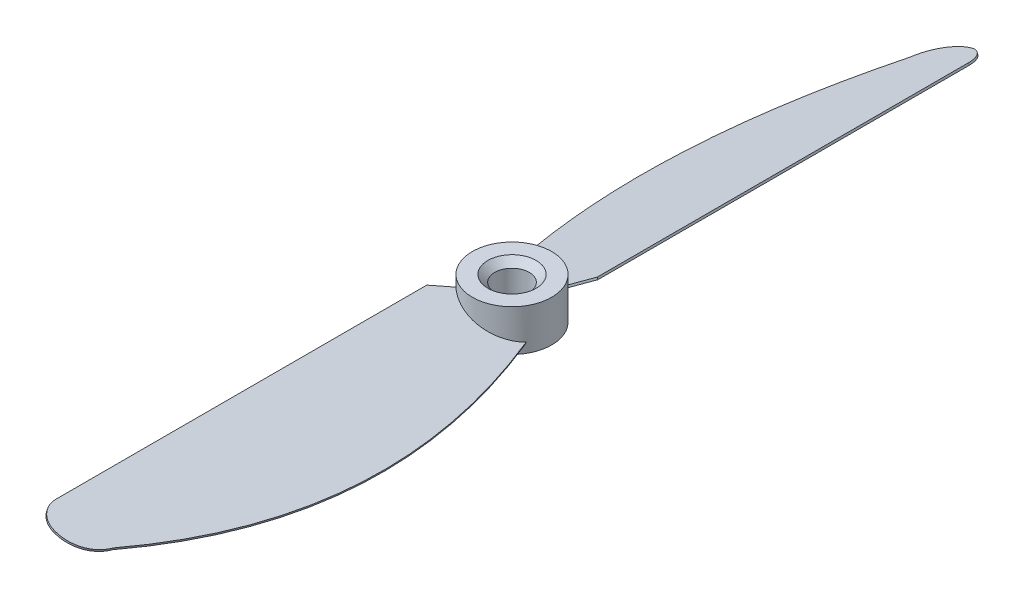
ISO-10303-21;
HEADER;
FILE_DESCRIPTION(('STEP AP214'),'2;1');
FILE_NAME('part.step','',(''),(''),'','','');
FILE_SCHEMA(('AUTOMOTIVE_DESIGN { 1 0 10303 214 1 1 1 1 }'));
ENDSEC;
DATA;
#1=APPLICATION_CONTEXT('core data for automotive mechanical design processes');
#2=APPLICATION_PROTOCOL_DEFINITION('international standard','automotive_design',2000,#1);
#3=PRODUCT_CONTEXT('',#1,'mechanical');
#4=PRODUCT('Part','Part','',(#3));
#5=PRODUCT_RELATED_PRODUCT_CATEGORY('part','',(#4));
#6=PRODUCT_DEFINITION_FORMATION('','',#4);
#7=PRODUCT_DEFINITION_CONTEXT('part definition',#1,'design');
#8=PRODUCT_DEFINITION('design','',#6,#7);
#9=PRODUCT_DEFINITION_SHAPE('','',#8);
#10=(LENGTH_UNIT() NAMED_UNIT(*) SI_UNIT(.MILLI.,.METRE.));
#11=(NAMED_UNIT(*) PLANE_ANGLE_UNIT() SI_UNIT($,.RADIAN.));
#12=(NAMED_UNIT(*) SI_UNIT($,.STERADIAN.) SOLID_ANGLE_UNIT());
#13=UNCERTAINTY_MEASURE_WITH_UNIT(LENGTH_MEASURE(1.E-05),#10,'distance_accuracy_value','');
#14=(GEOMETRIC_REPRESENTATION_CONTEXT(3) GLOBAL_UNCERTAINTY_ASSIGNED_CONTEXT((#13)) GLOBAL_UNIT_ASSIGNED_CONTEXT((#10,
#11,#12)) REPRESENTATION_CONTEXT('',''));
#15=CARTESIAN_POINT('',(0.,0.,0.));
#16=DIRECTION('',(0.,0.,1.));
#17=DIRECTION('',(1.,0.,0.));
#18=AXIS2_PLACEMENT_3D('',#15,#16,#17);
#19=CARTESIAN_POINT('',(0.,3.,0.));
#20=DIRECTION('',(0.,-1.,0.));
#21=DIRECTION('',(0.,0.,-1.));
#22=AXIS2_PLACEMENT_3D('',#19,#20,#21);
#23=CYLINDRICAL_SURFACE('',#22,5.75);
#24=CARTESIAN_POINT('',(-4.8920159777746,-1.88043468735762,-3.0217014533534));
#25=CARTESIAN_POINT('',(-4.9027984834071,-1.83112444759788,-3.00424775742399));
#26=CARTESIAN_POINT('',(-4.91352065409866,-1.78184257242605,-2.98667868683996));
#27=CARTESIAN_POINT('',(-4.93484432559993,-1.68333555125825,-2.95130979636263));
#28=CARTESIAN_POINT('',(-4.94544582640962,-1.63411040526227,-2.93350997646934));
#29=CARTESIAN_POINT('',(-4.95598699227839,-1.58491362385422,-2.91559478192142));
#30=B_SPLINE_CURVE_WITH_KNOTS('',3,(#24,#25,#26,#27,#28,#29),.UNSPECIFIED.,.F.,.F.,(4,2,4),(0.,
0.160221920016564,0.320443840033127),.UNSPECIFIED.);
#31=CARTESIAN_POINT('',(-4.8920159777746,-1.88043468735762,-3.0217014533534));
#32=VERTEX_POINT('',#31);
#33=CARTESIAN_POINT('',(-4.95598699227839,-1.58491362385422,-2.91559478192142));
#34=VERTEX_POINT('',#33);
#35=EDGE_CURVE('E60',#32,#34,#30,.T.);
#36=ORIENTED_EDGE('',*,*,#35,.F.);
#37=CARTESIAN_POINT('',(0.,-0.159015699309601,0.));
#38=DIRECTION('',(0.331932653611141,-0.943303086747131,0.));
#39=DIRECTION('',(-0.943303086747132,-0.331932653611141,0.));
#40=AXIS2_PLACEMENT_3D('',#37,#38,#39);
#41=ELLIPSE('',#40,6.09560180686803,5.75);
#42=CARTESIAN_POINT('',(3.98150996275321,1.24201137871389,-4.14850315372869));
#43=VERTEX_POINT('',#42);
#44=EDGE_CURVE('E61',#32,#43,#41,.T.);
#45=ORIENTED_EDGE('',*,*,#44,.T.);
#46=CARTESIAN_POINT('',(0.,3.1703775042026,0.));
#47=DIRECTION('',(-0.754266546104331,-0.26541384173975,-0.600530990075275));
#48=DIRECTION('',(0.207639872473479,-0.964134582209842,0.165318452527993));
#49=AXIS2_PLACEMENT_3D('',#46,#47,#48);
#50=ELLIPSE('',#49,21.6642808163643,5.75);
#51=CARTESIAN_POINT('',(3.92189172051821,1.53906411032063,-4.2049096699609));
#52=VERTEX_POINT('',#51);
#53=EDGE_CURVE('E252',#52,#43,#50,.T.);
#54=ORIENTED_EDGE('',*,*,#53,.F.);
#55=CARTESIAN_POINT('',(0.,0.1590156993096,0.));
#56=DIRECTION('',(0.331932653611141,-0.943303086747131,0.));
#57=DIRECTION('',(-0.943303086747132,-0.331932653611141,0.));
#58=AXIS2_PLACEMENT_3D('',#55,#56,#57);
#59=ELLIPSE('',#58,6.09560180686803,5.75);
#60=EDGE_CURVE('E355',#34,#52,#59,.T.);
#61=ORIENTED_EDGE('',*,*,#60,.F.);
#62=EDGE_LOOP('',(#36,#45,#54,#61));
#63=FACE_BOUND('',#62,.T.);
#64=CARTESIAN_POINT('',(4.8920159777746,-1.88043468735762,3.0217014533534));
#65=CARTESIAN_POINT('',(4.9027984834071,-1.83112444759788,3.00424775742399));
#66=CARTESIAN_POINT('',(4.91352065409866,-1.78184257242605,2.98667868683996));
#67=CARTESIAN_POINT('',(4.93484432559993,-1.68333555125825,2.95130979636263));
#68=CARTESIAN_POINT('',(4.94544582640962,-1.63411040526227,2.93350997646934));
#69=CARTESIAN_POINT('',(4.95598699227839,-1.58491362385422,2.91559478192142));
#70=B_SPLINE_CURVE_WITH_KNOTS('',3,(#64,#65,#66,#67,#68,#69),.UNSPECIFIED.,.F.,.F.,(4,2,4),(0.,
0.160221920016564,0.320443840033127),.UNSPECIFIED.);
#71=CARTESIAN_POINT('',(4.8920159777746,-1.88043468735762,3.0217014533534));
#72=VERTEX_POINT('',#71);
#73=CARTESIAN_POINT('',(4.95598699227839,-1.58491362385422,2.91559478192142));
#74=VERTEX_POINT('',#73);
#75=EDGE_CURVE('E226',#72,#74,#70,.T.);
#76=ORIENTED_EDGE('',*,*,#75,.F.);
#77=CARTESIAN_POINT('',(0.,-0.159015699309601,0.));
#78=DIRECTION('',(-0.331932653611141,-0.943303086747131,0.));
#79=DIRECTION('',(0.943303086747132,-0.331932653611141,0.));
#80=AXIS2_PLACEMENT_3D('',#77,#78,#79);
#81=ELLIPSE('',#80,6.09560180686803,5.75);
#82=CARTESIAN_POINT('',(-3.98150996275321,1.24201137871389,4.14850315372869));
#83=VERTEX_POINT('',#82);
#84=EDGE_CURVE('E231',#72,#83,#81,.T.);
#85=ORIENTED_EDGE('',*,*,#84,.T.);
#86=CARTESIAN_POINT('',(0.,3.1703775042026,0.));
#87=DIRECTION('',(0.754266546104331,-0.26541384173975,0.600530990075275));
#88=DIRECTION('',(-0.207639872473479,-0.964134582209842,-0.165318452527993));
#89=AXIS2_PLACEMENT_3D('',#86,#87,#88);
#90=ELLIPSE('',#89,21.6642808163643,5.75);
#91=CARTESIAN_POINT('',(-3.92189172051821,1.53906411032063,4.2049096699609));
#92=VERTEX_POINT('',#91);
#93=EDGE_CURVE('E237',#92,#83,#90,.T.);
#94=ORIENTED_EDGE('',*,*,#93,.F.);
#95=CARTESIAN_POINT('',(0.,0.1590156993096,0.));
#96=DIRECTION('',(-0.331932653611141,-0.943303086747131,0.));
#97=DIRECTION('',(0.943303086747132,-0.331932653611141,0.));
#98=AXIS2_PLACEMENT_3D('',#95,#96,#97);
#99=ELLIPSE('',#98,6.09560180686803,5.75);
#100=EDGE_CURVE('E327',#74,#92,#99,.T.);
#101=ORIENTED_EDGE('',*,*,#100,.F.);
#102=EDGE_LOOP('',(#76,#85,#94,#101));
#103=FACE_BOUND('',#102,.T.);
#104=CARTESIAN_POINT('',(0.,3.,0.));
#105=DIRECTION('',(0.,1.,0.));
#106=DIRECTION('',(0.,0.,1.));
#107=AXIS2_PLACEMENT_3D('',#104,#105,#106);
#108=CIRCLE('',#107,5.75);
#109=CARTESIAN_POINT('',(0.,3.,5.75));
#110=VERTEX_POINT('',#109);
#111=EDGE_CURVE('E324',#110,#110,#108,.T.);
#112=ORIENTED_EDGE('',*,*,#111,.F.);
#113=EDGE_LOOP('',(#112));
#114=FACE_BOUND('',#113,.T.);
#115=CARTESIAN_POINT('',(0.,-3.,0.));
#116=DIRECTION('',(0.,1.,0.));
#117=DIRECTION('',(0.,0.,1.));
#118=AXIS2_PLACEMENT_3D('',#115,#116,#117);
#119=CIRCLE('',#118,5.75);
#120=CARTESIAN_POINT('',(0.,-3.,5.75));
#121=VERTEX_POINT('',#120);
#122=EDGE_CURVE('E322',#121,#121,#119,.T.);
#123=ORIENTED_EDGE('',*,*,#122,.T.);
#124=EDGE_LOOP('',(#123));
#125=FACE_BOUND('',#124,.T.);
#126=ADVANCED_FACE('F41',(#63,#103,#114,#125),#23,.T.);
#127=CARTESIAN_POINT('',(0.,3.,0.));
#128=DIRECTION('',(0.,1.,0.));
#129=DIRECTION('',(0.,0.,1.));
#130=AXIS2_PLACEMENT_3D('',#127,#128,#129);
#131=PLANE('',#130);
#132=CARTESIAN_POINT('',(0.,3.,0.));
#133=DIRECTION('',(0.,1.,0.));
#134=DIRECTION('',(0.,0.,1.));
#135=AXIS2_PLACEMENT_3D('',#132,#133,#134);
#136=CIRCLE('',#135,3.50000000000003);
#137=CARTESIAN_POINT('',(0.,3.,3.50000000000003));
#138=VERTEX_POINT('',#137);
#139=EDGE_CURVE('E11',#138,#138,#136,.F.);
#140=ORIENTED_EDGE('',*,*,#139,.T.);
#141=EDGE_LOOP('',(#140));
#142=FACE_BOUND('',#141,.T.);
#143=ORIENTED_EDGE('',*,*,#111,.T.);
#144=EDGE_LOOP('',(#143));
#145=FACE_BOUND('',#144,.T.);
#146=ADVANCED_FACE('F224',(#142,#145),#131,.T.);
#147=CARTESIAN_POINT('',(0.,-3.,0.));
#148=DIRECTION('',(0.,1.,0.));
#149=DIRECTION('',(0.,0.,1.));
#150=AXIS2_PLACEMENT_3D('',#147,#148,#149);
#151=PLANE('',#150);
#152=CARTESIAN_POINT('',(0.,-3.,0.));
#153=DIRECTION('',(0.,1.,0.));
#154=DIRECTION('',(0.,0.,1.));
#155=AXIS2_PLACEMENT_3D('',#152,#153,#154);
#156=CIRCLE('',#155,3.49999999999991);
#157=CARTESIAN_POINT('',(0.,-3.,3.49999999999991));
#158=VERTEX_POINT('',#157);
#159=EDGE_CURVE('E404',#158,#158,#156,.T.);
#160=ORIENTED_EDGE('',*,*,#159,.T.);
#161=EDGE_LOOP('',(#160));
#162=FACE_BOUND('',#161,.T.);
#163=ORIENTED_EDGE('',*,*,#122,.F.);
#164=EDGE_LOOP('',(#163));
#165=FACE_BOUND('',#164,.T.);
#166=ADVANCED_FACE('F219',(#162,#165),#151,.F.);
#167=CARTESIAN_POINT('',(4.49028352582618,-1.73907172492231,1.84878855702583));
#168=CARTESIAN_POINT('',(14.9107340202523,-5.40585479076167,31.6127789858751));
#169=CARTESIAN_POINT('',(1.83195566354301,-0.803650401815136,59.7177951446198));
#170=B_SPLINE_CURVE_WITH_KNOTS('',2,(#167,#168,#169),.UNSPECIFIED.,.F.,.F.,(3,3),(0.,1.),.UNSPECIFIED.);
#171=DIRECTION('',(0.331932653611141,0.943303086747131,0.));
#172=VECTOR('',#171,1.);
#173=SURFACE_OF_LINEAR_EXTRUSION('',#170,#172);
#174=CARTESIAN_POINT('',(1.83195566354301,-0.803650401815135,59.7177951446198));
#175=VERTEX_POINT('',#174);
#176=EDGE_CURVE('E205',#72,#175,#170,.T.);
#177=ORIENTED_EDGE('',*,*,#176,.F.);
#178=ORIENTED_EDGE('',*,*,#75,.T.);
#179=CARTESIAN_POINT('',(4.58986332190952,-1.45608079889817,1.84878855702583));
#180=CARTESIAN_POINT('',(15.0103138163356,-5.12286386473753,31.6127789858751));
#181=CARTESIAN_POINT('',(1.93153545962635,-0.520659475790996,59.7177951446198));
#182=B_SPLINE_CURVE_WITH_KNOTS('',2,(#179,#180,#181),.UNSPECIFIED.,.F.,.F.,(3,3),(0.,1.),.UNSPECIFIED.);
#183=CARTESIAN_POINT('',(1.93153545962635,-0.520659475790996,59.7177951446198));
#184=VERTEX_POINT('',#183);
#185=EDGE_CURVE('E160',#74,#184,#182,.T.);
#186=ORIENTED_EDGE('',*,*,#185,.T.);
#187=DIRECTION('',(0.331932653611141,0.943303086747131,0.));
#188=VECTOR('',#187,1.);
#189=CARTESIAN_POINT('',(1.83195566354301,-0.803650401815135,59.7177951446198));
#190=LINE('',#189,#188);
#191=EDGE_CURVE('E321',#175,#184,#190,.T.);
#192=ORIENTED_EDGE('',*,*,#191,.F.);
#193=EDGE_LOOP('',(#177,#178,#186,#192));
#194=FACE_BOUND('',#193,.T.);
#195=ADVANCED_FACE('F212',(#194),#173,.F.);
#196=CARTESIAN_POINT('',(-2.74252698047144,0.806033891874515,58.5));
#197=DIRECTION('',(0.331932653611141,0.943303086747131,0.));
#198=DIRECTION('',(-0.943303086747131,0.331932653611141,0.));
#199=AXIS2_PLACEMENT_3D('',#196,#197,#198);
#200=CYLINDRICAL_SURFACE('',#199,5.);
#201=CARTESIAN_POINT('',(-2.64294718438809,1.08902481789865,58.5));
#202=DIRECTION('',(-0.331932653611141,-0.943303086747131,0.));
#203=DIRECTION('',(0.943303086747131,-0.331932653611141,0.));
#204=AXIS2_PLACEMENT_3D('',#201,#202,#203);
#205=CIRCLE('',#204,5.);
#206=CARTESIAN_POINT('',(-2.64294718438809,1.08902481789865,63.5));
#207=VERTEX_POINT('',#206);
#208=EDGE_CURVE('E297',#184,#207,#205,.T.);
#209=ORIENTED_EDGE('',*,*,#208,.T.);
#210=DIRECTION('',(0.331932653611141,0.943303086747131,0.));
#211=VECTOR('',#210,1.);
#212=CARTESIAN_POINT('',(-2.74252698047143,0.806033891874515,63.5));
#213=LINE('',#212,#211);
#214=CARTESIAN_POINT('',(-2.74252698047143,0.806033891874515,63.5));
#215=VERTEX_POINT('',#214);
#216=EDGE_CURVE('E294',#215,#207,#213,.T.);
#217=ORIENTED_EDGE('',*,*,#216,.F.);
#218=CARTESIAN_POINT('',(-2.74252698047144,0.806033891874515,58.5));
#219=DIRECTION('',(-0.331932653611141,-0.943303086747131,0.));
#220=DIRECTION('',(0.943303086747131,-0.331932653611141,0.));
#221=AXIS2_PLACEMENT_3D('',#218,#219,#220);
#222=CIRCLE('',#221,5.);
#223=EDGE_CURVE('E210',#175,#215,#222,.T.);
#224=ORIENTED_EDGE('',*,*,#223,.F.);
#225=ORIENTED_EDGE('',*,*,#191,.T.);
#226=EDGE_LOOP('',(#209,#217,#224,#225));
#227=FACE_BOUND('',#226,.T.);
#228=ADVANCED_FACE('F218',(#227),#200,.T.);
#229=CARTESIAN_POINT('',(-2.94553453687123,0.877468871623457,63.5));
#230=DIRECTION('',(0.,0.,-1.));
#231=DIRECTION('',(-1.,0.,0.));
#232=AXIS2_PLACEMENT_3D('',#229,#230,#231);
#233=PLANE('',#232);
#234=DIRECTION('',(-0.943303086747131,0.331932653611141,0.));
#235=VECTOR('',#234,1.);
#236=CARTESIAN_POINT('',(-2.84595474078788,1.1604597976476,63.5));
#237=LINE('',#236,#235);
#238=CARTESIAN_POINT('',(-2.84595474078788,1.1604597976476,63.5));
#239=VERTEX_POINT('',#238);
#240=EDGE_CURVE('E287',#207,#239,#237,.T.);
#241=ORIENTED_EDGE('',*,*,#240,.T.);
#242=DIRECTION('',(0.331932653611141,0.943303086747131,0.));
#243=VECTOR('',#242,1.);
#244=CARTESIAN_POINT('',(-2.94553453687123,0.877468871623457,63.5));
#245=LINE('',#244,#243);
#246=CARTESIAN_POINT('',(-2.94553453687123,0.877468871623457,63.5));
#247=VERTEX_POINT('',#246);
#248=EDGE_CURVE('E292',#247,#239,#245,.T.);
#249=ORIENTED_EDGE('',*,*,#248,.F.);
#250=DIRECTION('',(-0.943303086747131,0.331932653611141,0.));
#251=VECTOR('',#250,1.);
#252=CARTESIAN_POINT('',(-2.94553453687123,0.877468871623457,63.5));
#253=LINE('',#252,#251);
#254=EDGE_CURVE('E546',#215,#247,#253,.T.);
#255=ORIENTED_EDGE('',*,*,#254,.F.);
#256=ORIENTED_EDGE('',*,*,#216,.T.);
#257=EDGE_LOOP('',(#241,#249,#255,#256));
#258=FACE_BOUND('',#257,.T.);
#259=ADVANCED_FACE('F280',(#258),#233,.F.);
#260=CARTESIAN_POINT('',(-2.94553453687125,0.877468871623464,60.5));
#261=DIRECTION('',(0.331932653611141,0.943303086747131,0.));
#262=DIRECTION('',(-0.943303086747131,0.331932653611141,0.));
#263=AXIS2_PLACEMENT_3D('',#260,#261,#262);
#264=CYLINDRICAL_SURFACE('',#263,3.);
#265=CARTESIAN_POINT('',(-2.8459547407879,1.1604597976476,60.5));
#266=DIRECTION('',(-0.331932653611141,-0.943303086747131,0.));
#267=DIRECTION('',(-0.943303086747131,0.331932653611141,0.));
#268=AXIS2_PLACEMENT_3D('',#265,#266,#267);
#269=CIRCLE('',#268,3.);
#270=CARTESIAN_POINT('',(-5.6758640010293,2.15625775848103,60.5));
#271=VERTEX_POINT('',#270);
#272=EDGE_CURVE('E300',#239,#271,#269,.T.);
#273=ORIENTED_EDGE('',*,*,#272,.T.);
#274=DIRECTION('',(0.331932653611141,0.943303086747131,0.));
#275=VECTOR('',#274,1.);
#276=CARTESIAN_POINT('',(-5.77544379711264,1.87326683245689,60.5));
#277=LINE('',#276,#275);
#278=CARTESIAN_POINT('',(-5.77544379711264,1.87326683245689,60.5));
#279=VERTEX_POINT('',#278);
#280=EDGE_CURVE('E302',#279,#271,#277,.T.);
#281=ORIENTED_EDGE('',*,*,#280,.F.);
#282=CARTESIAN_POINT('',(-2.94553453687125,0.877468871623464,60.5));
#283=DIRECTION('',(-0.331932653611141,-0.943303086747131,0.));
#284=DIRECTION('',(-0.943303086747131,0.331932653611141,0.));
#285=AXIS2_PLACEMENT_3D('',#282,#283,#284);
#286=CIRCLE('',#285,3.);
#287=EDGE_CURVE('E304',#247,#279,#286,.T.);
#288=ORIENTED_EDGE('',*,*,#287,.F.);
#289=ORIENTED_EDGE('',*,*,#248,.T.);
#290=EDGE_LOOP('',(#273,#281,#288,#289));
#291=FACE_BOUND('',#290,.T.);
#292=ADVANCED_FACE('F273',(#291),#264,.T.);
#293=CARTESIAN_POINT('',(-5.77544379711264,1.87326683245689,6.68067590985652));
#294=DIRECTION('',(0.943303086747131,-0.331932653611141,0.));
#295=DIRECTION('',(0.331932653611141,0.943303086747131,0.));
#296=AXIS2_PLACEMENT_3D('',#293,#294,#295);
#297=PLANE('',#296);
#298=DIRECTION('',(0.,0.,-1.));
#299=VECTOR('',#298,1.);
#300=CARTESIAN_POINT('',(-5.6758640010293,2.15625775848103,6.68067590985652));
#301=LINE('',#300,#299);
#302=CARTESIAN_POINT('',(-5.6758640010293,2.15625775848103,6.68067590985652));
#303=VERTEX_POINT('',#302);
#304=EDGE_CURVE('E306',#271,#303,#301,.T.);
#305=ORIENTED_EDGE('',*,*,#304,.T.);
#306=DIRECTION('',(0.331932653611141,0.943303086747131,0.));
#307=VECTOR('',#306,1.);
#308=CARTESIAN_POINT('',(-5.77544379711264,1.87326683245689,6.68067590985652));
#309=LINE('',#308,#307);
#310=CARTESIAN_POINT('',(-5.77544379711264,1.87326683245689,6.68067590985652));
#311=VERTEX_POINT('',#310);
#312=EDGE_CURVE('E312',#311,#303,#309,.T.);
#313=ORIENTED_EDGE('',*,*,#312,.F.);
#314=DIRECTION('',(0.,0.,-1.));
#315=VECTOR('',#314,1.);
#316=CARTESIAN_POINT('',(-5.77544379711264,1.87326683245689,6.68067590985652));
#317=LINE('',#316,#315);
#318=EDGE_CURVE('E337',#279,#311,#317,.T.);
#319=ORIENTED_EDGE('',*,*,#318,.F.);
#320=ORIENTED_EDGE('',*,*,#280,.T.);
#321=EDGE_LOOP('',(#305,#313,#319,#320));
#322=FACE_BOUND('',#321,.T.);
#323=ADVANCED_FACE('F269',(#322),#297,.F.);
#324=CARTESIAN_POINT('',(-3.33757817375582,1.01542250132185,3.23958081686553));
#325=DIRECTION('',(0.754266546104331,-0.26541384173975,0.600530990075275));
#326=DIRECTION('',(0.622870500816214,0.,-0.782324957554698));
#327=AXIS2_PLACEMENT_3D('',#324,#325,#326);
#328=PLANE('',#327);
#329=DIRECTION('',(0.566482736625318,-0.199335845111412,-0.799601481964115));
#330=VECTOR('',#329,1.);
#331=CARTESIAN_POINT('',(-3.23799837767248,1.29841342734599,3.23958081686553));
#332=LINE('',#331,#330);
#333=EDGE_CURVE('E208',#303,#92,#332,.T.);
#334=ORIENTED_EDGE('',*,*,#333,.T.);
#335=ORIENTED_EDGE('',*,*,#93,.T.);
#336=DIRECTION('',(0.566482736625318,-0.199335845111412,-0.799601481964115));
#337=VECTOR('',#336,1.);
#338=CARTESIAN_POINT('',(-3.33757817375582,1.01542250132185,3.23958081686553));
#339=LINE('',#338,#337);
#340=EDGE_CURVE('E318',#311,#83,#339,.T.);
#341=ORIENTED_EDGE('',*,*,#340,.F.);
#342=ORIENTED_EDGE('',*,*,#312,.T.);
#343=EDGE_LOOP('',(#334,#335,#341,#342));
#344=FACE_BOUND('',#343,.T.);
#345=ADVANCED_FACE('F263',(#344),#328,.F.);
#346=CARTESIAN_POINT('',(0.695442925644084,-0.40373048821182,5.14907988210968));
#347=DIRECTION('',(-0.331932653611141,-0.943303086747131,0.));
#348=DIRECTION('',(0.943303086747132,-0.331932653611141,0.));
#349=AXIS2_PLACEMENT_3D('',#346,#347,#348);
#350=PLANE('',#349);
#351=ORIENTED_EDGE('',*,*,#84,.F.);
#352=ORIENTED_EDGE('',*,*,#176,.T.);
#353=ORIENTED_EDGE('',*,*,#223,.T.);
#354=ORIENTED_EDGE('',*,*,#254,.T.);
#355=ORIENTED_EDGE('',*,*,#287,.T.);
#356=ORIENTED_EDGE('',*,*,#318,.T.);
#357=ORIENTED_EDGE('',*,*,#340,.T.);
#358=EDGE_LOOP('',(#351,#352,#353,#354,#355,#356,#357));
#359=FACE_BOUND('',#358,.T.);
#360=ADVANCED_FACE('F257',(#359),#350,.T.);
#361=CARTESIAN_POINT('',(0.795022721727426,-0.120739562187681,5.14907988210968));
#362=DIRECTION('',(-0.331932653611141,-0.943303086747131,0.));
#363=DIRECTION('',(0.943303086747132,-0.331932653611141,0.));
#364=AXIS2_PLACEMENT_3D('',#361,#362,#363);
#365=PLANE('',#364);
#366=ORIENTED_EDGE('',*,*,#185,.F.);
#367=ORIENTED_EDGE('',*,*,#100,.T.);
#368=ORIENTED_EDGE('',*,*,#333,.F.);
#369=ORIENTED_EDGE('',*,*,#304,.F.);
#370=ORIENTED_EDGE('',*,*,#272,.F.);
#371=ORIENTED_EDGE('',*,*,#240,.F.);
#372=ORIENTED_EDGE('',*,*,#208,.F.);
#373=EDGE_LOOP('',(#366,#367,#368,#369,#370,#371,#372));
#374=FACE_BOUND('',#373,.T.);
#375=ADVANCED_FACE('F256',(#374),#365,.F.);
#376=CARTESIAN_POINT('',(-4.49028352582618,-1.73907172492231,-1.84878855702583));
#377=CARTESIAN_POINT('',(-14.9107340202523,-5.40585479076167,-31.6127789858751));
#378=CARTESIAN_POINT('',(-1.83195566354301,-0.803650401815136,-59.7177951446198));
#379=B_SPLINE_CURVE_WITH_KNOTS('',2,(#376,#377,#378),.UNSPECIFIED.,.F.,.F.,(3,3),(0.,1.),.UNSPECIFIED.);
#380=DIRECTION('',(-0.331932653611141,0.943303086747131,0.));
#381=VECTOR('',#380,1.);
#382=SURFACE_OF_LINEAR_EXTRUSION('',#379,#381);
#383=CARTESIAN_POINT('',(-1.83195566354301,-0.803650401815135,-59.7177951446198));
#384=VERTEX_POINT('',#383);
#385=EDGE_CURVE('E136',#32,#384,#379,.T.);
#386=ORIENTED_EDGE('',*,*,#385,.F.);
#387=ORIENTED_EDGE('',*,*,#35,.T.);
#388=CARTESIAN_POINT('',(-4.58986332190952,-1.45608079889817,-1.84878855702583));
#389=CARTESIAN_POINT('',(-15.0103138163356,-5.12286386473753,-31.6127789858751));
#390=CARTESIAN_POINT('',(-1.93153545962635,-0.520659475790996,-59.7177951446198));
#391=B_SPLINE_CURVE_WITH_KNOTS('',2,(#388,#389,#390),.UNSPECIFIED.,.F.,.F.,(3,3),(0.,1.),.UNSPECIFIED.);
#392=CARTESIAN_POINT('',(-1.93153545962635,-0.520659475790996,-59.7177951446198));
#393=VERTEX_POINT('',#392);
#394=EDGE_CURVE('E152',#34,#393,#391,.T.);
#395=ORIENTED_EDGE('',*,*,#394,.T.);
#396=DIRECTION('',(-0.331932653611141,0.943303086747131,0.));
#397=VECTOR('',#396,1.);
#398=CARTESIAN_POINT('',(-1.83195566354301,-0.803650401815135,-59.7177951446198));
#399=LINE('',#398,#397);
#400=EDGE_CURVE('E151',#384,#393,#399,.T.);
#401=ORIENTED_EDGE('',*,*,#400,.F.);
#402=EDGE_LOOP('',(#386,#387,#395,#401));
#403=FACE_BOUND('',#402,.T.);
#404=ADVANCED_FACE('F155',(#403),#382,.F.);
#405=CARTESIAN_POINT('',(2.74252698047144,0.806033891874515,-58.5));
#406=DIRECTION('',(-0.331932653611141,0.943303086747131,0.));
#407=DIRECTION('',(-0.943303086747131,-0.331932653611141,0.));
#408=AXIS2_PLACEMENT_3D('',#405,#406,#407);
#409=CYLINDRICAL_SURFACE('',#408,5.);
#410=CARTESIAN_POINT('',(2.64294718438809,1.08902481789865,-58.5));
#411=DIRECTION('',(0.331932653611141,-0.943303086747131,0.));
#412=DIRECTION('',(-0.943303086747131,-0.331932653611141,0.));
#413=AXIS2_PLACEMENT_3D('',#410,#411,#412);
#414=CIRCLE('',#413,5.);
#415=CARTESIAN_POINT('',(2.64294718438809,1.08902481789865,-63.5));
#416=VERTEX_POINT('',#415);
#417=EDGE_CURVE('E176',#393,#416,#414,.T.);
#418=ORIENTED_EDGE('',*,*,#417,.T.);
#419=DIRECTION('',(-0.331932653611141,0.943303086747131,0.));
#420=VECTOR('',#419,1.);
#421=CARTESIAN_POINT('',(2.74252698047143,0.806033891874515,-63.5));
#422=LINE('',#421,#420);
#423=CARTESIAN_POINT('',(2.74252698047143,0.806033891874515,-63.5));
#424=VERTEX_POINT('',#423);
#425=EDGE_CURVE('E158',#424,#416,#422,.T.);
#426=ORIENTED_EDGE('',*,*,#425,.F.);
#427=CARTESIAN_POINT('',(2.74252698047144,0.806033891874515,-58.5));
#428=DIRECTION('',(0.331932653611141,-0.943303086747131,0.));
#429=DIRECTION('',(-0.943303086747131,-0.331932653611141,0.));
#430=AXIS2_PLACEMENT_3D('',#427,#428,#429);
#431=CIRCLE('',#430,5.);
#432=EDGE_CURVE('E145',#384,#424,#431,.T.);
#433=ORIENTED_EDGE('',*,*,#432,.F.);
#434=ORIENTED_EDGE('',*,*,#400,.T.);
#435=EDGE_LOOP('',(#418,#426,#433,#434));
#436=FACE_BOUND('',#435,.T.);
#437=ADVANCED_FACE('F159',(#436),#409,.T.);
#438=CARTESIAN_POINT('',(2.94553453687123,0.877468871623457,-63.5));
#439=DIRECTION('',(0.,0.,1.));
#440=DIRECTION('',(1.,0.,0.));
#441=AXIS2_PLACEMENT_3D('',#438,#439,#440);
#442=PLANE('',#441);
#443=DIRECTION('',(0.943303086747131,0.331932653611141,0.));
#444=VECTOR('',#443,1.);
#445=CARTESIAN_POINT('',(2.84595474078788,1.1604597976476,-63.5));
#446=LINE('',#445,#444);
#447=CARTESIAN_POINT('',(2.84595474078788,1.1604597976476,-63.5));
#448=VERTEX_POINT('',#447);
#449=EDGE_CURVE('E183',#416,#448,#446,.T.);
#450=ORIENTED_EDGE('',*,*,#449,.T.);
#451=DIRECTION('',(-0.331932653611141,0.943303086747131,0.));
#452=VECTOR('',#451,1.);
#453=CARTESIAN_POINT('',(2.94553453687123,0.877468871623457,-63.5));
#454=LINE('',#453,#452);
#455=CARTESIAN_POINT('',(2.94553453687123,0.877468871623457,-63.5));
#456=VERTEX_POINT('',#455);
#457=EDGE_CURVE('E196',#456,#448,#454,.T.);
#458=ORIENTED_EDGE('',*,*,#457,.F.);
#459=DIRECTION('',(0.943303086747131,0.331932653611141,0.));
#460=VECTOR('',#459,1.);
#461=CARTESIAN_POINT('',(2.94553453687123,0.877468871623457,-63.5));
#462=LINE('',#461,#460);
#463=EDGE_CURVE('E162',#424,#456,#462,.T.);
#464=ORIENTED_EDGE('',*,*,#463,.F.);
#465=ORIENTED_EDGE('',*,*,#425,.T.);
#466=EDGE_LOOP('',(#450,#458,#464,#465));
#467=FACE_BOUND('',#466,.T.);
#468=ADVANCED_FACE('F373',(#467),#442,.F.);
#469=CARTESIAN_POINT('',(2.94553453687125,0.877468871623464,-60.5));
#470=DIRECTION('',(-0.331932653611141,0.943303086747131,0.));
#471=DIRECTION('',(-0.943303086747131,-0.331932653611141,0.));
#472=AXIS2_PLACEMENT_3D('',#469,#470,#471);
#473=CYLINDRICAL_SURFACE('',#472,3.);
#474=CARTESIAN_POINT('',(2.8459547407879,1.1604597976476,-60.5));
#475=DIRECTION('',(0.331932653611141,-0.943303086747131,0.));
#476=DIRECTION('',(0.943303086747131,0.331932653611141,0.));
#477=AXIS2_PLACEMENT_3D('',#474,#475,#476);
#478=CIRCLE('',#477,3.);
#479=CARTESIAN_POINT('',(5.6758640010293,2.15625775848103,-60.5));
#480=VERTEX_POINT('',#479);
#481=EDGE_CURVE('E190',#448,#480,#478,.T.);
#482=ORIENTED_EDGE('',*,*,#481,.T.);
#483=DIRECTION('',(-0.331932653611141,0.943303086747131,0.));
#484=VECTOR('',#483,1.);
#485=CARTESIAN_POINT('',(5.77544379711264,1.87326683245689,-60.5));
#486=LINE('',#485,#484);
#487=CARTESIAN_POINT('',(5.77544379711264,1.87326683245689,-60.5));
#488=VERTEX_POINT('',#487);
#489=EDGE_CURVE('E191',#488,#480,#486,.T.);
#490=ORIENTED_EDGE('',*,*,#489,.F.);
#491=CARTESIAN_POINT('',(2.94553453687125,0.877468871623464,-60.5));
#492=DIRECTION('',(0.331932653611141,-0.943303086747131,0.));
#493=DIRECTION('',(0.943303086747131,0.331932653611141,0.));
#494=AXIS2_PLACEMENT_3D('',#491,#492,#493);
#495=CIRCLE('',#494,3.);
#496=EDGE_CURVE('E164',#456,#488,#495,.T.);
#497=ORIENTED_EDGE('',*,*,#496,.F.);
#498=ORIENTED_EDGE('',*,*,#457,.T.);
#499=EDGE_LOOP('',(#482,#490,#497,#498));
#500=FACE_BOUND('',#499,.T.);
#501=ADVANCED_FACE('F367',(#500),#473,.T.);
#502=CARTESIAN_POINT('',(5.77544379711264,1.87326683245689,-6.68067590985652));
#503=DIRECTION('',(-0.943303086747131,-0.331932653611141,0.));
#504=DIRECTION('',(0.331932653611141,-0.943303086747131,0.));
#505=AXIS2_PLACEMENT_3D('',#502,#503,#504);
#506=PLANE('',#505);
#507=DIRECTION('',(0.,0.,1.));
#508=VECTOR('',#507,1.);
#509=CARTESIAN_POINT('',(5.6758640010293,2.15625775848103,-6.68067590985652));
#510=LINE('',#509,#508);
#511=CARTESIAN_POINT('',(5.6758640010293,2.15625775848103,-6.68067590985652));
#512=VERTEX_POINT('',#511);
#513=EDGE_CURVE('E188',#480,#512,#510,.T.);
#514=ORIENTED_EDGE('',*,*,#513,.T.);
#515=DIRECTION('',(-0.331932653611141,0.943303086747131,0.));
#516=VECTOR('',#515,1.);
#517=CARTESIAN_POINT('',(5.77544379711264,1.87326683245689,-6.68067590985652));
#518=LINE('',#517,#516);
#519=CARTESIAN_POINT('',(5.77544379711264,1.87326683245689,-6.68067590985652));
#520=VERTEX_POINT('',#519);
#521=EDGE_CURVE('E178',#520,#512,#518,.T.);
#522=ORIENTED_EDGE('',*,*,#521,.F.);
#523=DIRECTION('',(0.,0.,1.));
#524=VECTOR('',#523,1.);
#525=CARTESIAN_POINT('',(5.77544379711264,1.87326683245689,-6.68067590985652));
#526=LINE('',#525,#524);
#527=EDGE_CURVE('E175',#488,#520,#526,.T.);
#528=ORIENTED_EDGE('',*,*,#527,.F.);
#529=ORIENTED_EDGE('',*,*,#489,.T.);
#530=EDGE_LOOP('',(#514,#522,#528,#529));
#531=FACE_BOUND('',#530,.T.);
#532=ADVANCED_FACE('F365',(#531),#506,.F.);
#533=CARTESIAN_POINT('',(3.33757817375582,1.01542250132185,-3.23958081686553));
#534=DIRECTION('',(-0.754266546104331,-0.26541384173975,-0.600530990075275));
#535=DIRECTION('',(-0.622870500816214,0.,0.782324957554698));
#536=AXIS2_PLACEMENT_3D('',#533,#534,#535);
#537=PLANE('',#536);
#538=DIRECTION('',(-0.566482736625318,-0.199335845111412,0.799601481964115));
#539=VECTOR('',#538,1.);
#540=CARTESIAN_POINT('',(3.23799837767248,1.29841342734599,-3.23958081686553));
#541=LINE('',#540,#539);
#542=EDGE_CURVE('E146',#512,#52,#541,.T.);
#543=ORIENTED_EDGE('',*,*,#542,.T.);
#544=ORIENTED_EDGE('',*,*,#53,.T.);
#545=DIRECTION('',(-0.566482736625318,-0.199335845111412,0.799601481964115));
#546=VECTOR('',#545,1.);
#547=CARTESIAN_POINT('',(3.33757817375582,1.01542250132185,-3.23958081686553));
#548=LINE('',#547,#546);
#549=EDGE_CURVE('E173',#520,#43,#548,.T.);
#550=ORIENTED_EDGE('',*,*,#549,.F.);
#551=ORIENTED_EDGE('',*,*,#521,.T.);
#552=EDGE_LOOP('',(#543,#544,#550,#551));
#553=FACE_BOUND('',#552,.T.);
#554=ADVANCED_FACE('F357',(#553),#537,.F.);
#555=CARTESIAN_POINT('',(-0.695442925644084,-0.40373048821182,-5.14907988210968));
#556=DIRECTION('',(0.331932653611141,-0.943303086747131,0.));
#557=DIRECTION('',(-0.943303086747132,-0.331932653611141,0.));
#558=AXIS2_PLACEMENT_3D('',#555,#556,#557);
#559=PLANE('',#558);
#560=ORIENTED_EDGE('',*,*,#44,.F.);
#561=ORIENTED_EDGE('',*,*,#385,.T.);
#562=ORIENTED_EDGE('',*,*,#432,.T.);
#563=ORIENTED_EDGE('',*,*,#463,.T.);
#564=ORIENTED_EDGE('',*,*,#496,.T.);
#565=ORIENTED_EDGE('',*,*,#527,.T.);
#566=ORIENTED_EDGE('',*,*,#549,.T.);
#567=EDGE_LOOP('',(#560,#561,#562,#563,#564,#565,#566));
#568=FACE_BOUND('',#567,.T.);
#569=ADVANCED_FACE('F142',(#568),#559,.T.);
#570=CARTESIAN_POINT('',(-0.795022721727426,-0.120739562187681,-5.14907988210968));
#571=DIRECTION('',(0.331932653611141,-0.943303086747131,0.));
#572=DIRECTION('',(-0.943303086747132,-0.331932653611141,0.));
#573=AXIS2_PLACEMENT_3D('',#570,#571,#572);
#574=PLANE('',#573);
#575=ORIENTED_EDGE('',*,*,#394,.F.);
#576=ORIENTED_EDGE('',*,*,#60,.T.);
#577=ORIENTED_EDGE('',*,*,#542,.F.);
#578=ORIENTED_EDGE('',*,*,#513,.F.);
#579=ORIENTED_EDGE('',*,*,#481,.F.);
#580=ORIENTED_EDGE('',*,*,#449,.F.);
#581=ORIENTED_EDGE('',*,*,#417,.F.);
#582=EDGE_LOOP('',(#575,#576,#577,#578,#579,#580,#581));
#583=FACE_BOUND('',#582,.T.);
#584=ADVANCED_FACE('F368',(#583),#574,.F.);
#585=CARTESIAN_POINT('',(0.,-3.57246325784199,0.));
#586=DIRECTION('',(0.,1.,0.));
#587=DIRECTION('',(0.,0.,1.));
#588=AXIS2_PLACEMENT_3D('',#585,#586,#587);
#589=CYLINDRICAL_SURFACE('',#588,2.5);
#590=CARTESIAN_POINT('',(0.,-2.00000000000009,0.));
#591=DIRECTION('',(0.,1.,0.));
#592=DIRECTION('',(0.,0.,1.));
#593=AXIS2_PLACEMENT_3D('',#590,#591,#592);
#594=CIRCLE('',#593,2.5);
#595=CARTESIAN_POINT('',(0.,-2.00000000000009,2.5));
#596=VERTEX_POINT('',#595);
#597=EDGE_CURVE('E49',#596,#596,#594,.F.);
#598=CARTESIAN_POINT('',(0.,1.99999999999998,0.));
#599=DIRECTION('',(0.,1.,0.));
#600=DIRECTION('',(0.,0.,1.));
#601=AXIS2_PLACEMENT_3D('',#598,#599,#600);
#602=CIRCLE('',#601,2.5);
#603=CARTESIAN_POINT('',(0.,1.99999999999997,2.5));
#604=VERTEX_POINT('',#603);
#605=EDGE_CURVE('E405',#604,#604,#602,.T.);
#606=CARTESIAN_POINT('',(0.,-2.00000000000009,2.5));
#607=CARTESIAN_POINT('',(0.,-1.95833333333342,2.5));
#608=CARTESIAN_POINT('',(0.,-1.91666666666675,2.5));
#609=CARTESIAN_POINT('',(0.,-1.83333333333342,2.5));
#610=CARTESIAN_POINT('',(0.,-1.79166666666675,2.5));
#611=CARTESIAN_POINT('',(0.,-1.70833333333342,2.5));
#612=CARTESIAN_POINT('',(0.,-1.66666666666675,2.5));
#613=CARTESIAN_POINT('',(0.,-1.58333333333342,2.5));
#614=CARTESIAN_POINT('',(0.,-1.54166666666675,2.5));
#615=CARTESIAN_POINT('',(0.,-1.45833333333341,2.5));
#616=CARTESIAN_POINT('',(0.,-1.41666666666675,2.5));
#617=CARTESIAN_POINT('',(0.,-1.33333333333341,2.5));
#618=CARTESIAN_POINT('',(0.,-1.29166666666675,2.5));
#619=CARTESIAN_POINT('',(0.,-1.20833333333341,2.5));
#620=CARTESIAN_POINT('',(0.,-1.16666666666674,2.5));
#621=CARTESIAN_POINT('',(0.,-1.08333333333341,2.5));
#622=CARTESIAN_POINT('',(0.,-1.04166666666674,2.5));
#623=CARTESIAN_POINT('',(0.,-0.958333333333406,2.5));
#624=CARTESIAN_POINT('',(0.,-0.916666666666739,2.5));
#625=CARTESIAN_POINT('',(0.,-0.833333333333404,2.5));
#626=CARTESIAN_POINT('',(0.,-0.791666666666737,2.5));
#627=CARTESIAN_POINT('',(0.,-0.708333333333402,2.5));
#628=CARTESIAN_POINT('',(0.,-0.666666666666735,2.5));
#629=CARTESIAN_POINT('',(0.,-0.5833333333334,2.5));
#630=CARTESIAN_POINT('',(0.,-0.541666666666733,2.5));
#631=CARTESIAN_POINT('',(0.,-0.458333333333398,2.5));
#632=CARTESIAN_POINT('',(0.,-0.416666666666731,2.5));
#633=CARTESIAN_POINT('',(0.,-0.333333333333396,2.5));
#634=CARTESIAN_POINT('',(0.,-0.291666666666729,2.5));
#635=CARTESIAN_POINT('',(0.,-0.208333333333394,2.5));
#636=CARTESIAN_POINT('',(0.,-0.166666666666727,2.5));
#637=CARTESIAN_POINT('',(0.,-0.0833333333333921,2.5));
#638=CARTESIAN_POINT('',(0.,-0.0416666666667247,2.5));
#639=CARTESIAN_POINT('',(0.,0.04166666666661,2.5));
#640=CARTESIAN_POINT('',(0.,0.0833333333332773,2.5));
#641=CARTESIAN_POINT('',(0.,0.166666666666612,2.5));
#642=CARTESIAN_POINT('',(0.,0.208333333333279,2.5));
#643=CARTESIAN_POINT('',(0.,0.291666666666614,2.5));
#644=CARTESIAN_POINT('',(0.,0.333333333333281,2.5));
#645=CARTESIAN_POINT('',(0.,0.416666666666616,2.5));
#646=CARTESIAN_POINT('',(0.,0.458333333333283,2.5));
#647=CARTESIAN_POINT('',(0.,0.541666666666618,2.5));
#648=CARTESIAN_POINT('',(0.,0.583333333333286,2.5));
#649=CARTESIAN_POINT('',(0.,0.66666666666662,2.5));
#650=CARTESIAN_POINT('',(0.,0.708333333333287,2.5));
#651=CARTESIAN_POINT('',(0.,0.791666666666622,2.5));
#652=CARTESIAN_POINT('',(0.,0.833333333333289,2.5));
#653=CARTESIAN_POINT('',(0.,0.916666666666624,2.5));
#654=CARTESIAN_POINT('',(0.,0.958333333333291,2.5));
#655=CARTESIAN_POINT('',(0.,1.04166666666663,2.5));
#656=CARTESIAN_POINT('',(0.,1.08333333333329,2.5));
#657=CARTESIAN_POINT('',(0.,1.16666666666663,2.5));
#658=CARTESIAN_POINT('',(0.,1.20833333333329,2.5));
#659=CARTESIAN_POINT('',(0.,1.29166666666663,2.5));
#660=CARTESIAN_POINT('',(0.,1.3333333333333,2.5));
#661=CARTESIAN_POINT('',(0.,1.41666666666663,2.5));
#662=CARTESIAN_POINT('',(0.,1.4583333333333,2.5));
#663=CARTESIAN_POINT('',(0.,1.54166666666663,2.5));
#664=CARTESIAN_POINT('',(0.,1.5833333333333,2.5));
#665=CARTESIAN_POINT('',(0.,1.66666666666664,2.5));
#666=CARTESIAN_POINT('',(0.,1.7083333333333,2.5));
#667=CARTESIAN_POINT('',(0.,1.79166666666664,2.5));
#668=CARTESIAN_POINT('',(0.,1.83333333333331,2.5));
#669=CARTESIAN_POINT('',(0.,1.91666666666664,2.5));
#670=CARTESIAN_POINT('',(0.,1.95833333333331,2.5));
#671=CARTESIAN_POINT('',(0.,1.99999999999997,2.5));
#672=B_SPLINE_CURVE_WITH_KNOTS('',3,(#606,#607,#608,#609,#610,#611,#612,#613,#614,#615,#616,
#617,#618,#619,#620,#621,#622,#623,#624,#625,#626,#627,#628,#629,#630,#631,#632,#633,#634,#635,
#636,#637,#638,#639,#640,#641,#642,#643,#644,#645,#646,#647,#648,#649,#650,#651,#652,#653,#654,
#655,#656,#657,#658,#659,#660,#661,#662,#663,#664,#665,#666,#667,#668,#669,#670,#671),
.UNSPECIFIED.,.F.,.F.,(4,2,2,2,2,2,2,2,2,2,2,2,2,2,2,2,2,2,2,2,2,2,2,2,2,2,2,2,2,2,2,2,4),(0.,
0.125000000000002,0.250000000000004,0.375000000000006,0.500000000000008,0.62500000000001,
0.750000000000012,0.875000000000014,1.00000000000002,1.12500000000002,1.25000000000002,
1.37500000000002,1.50000000000002,1.62500000000003,1.75000000000003,1.87500000000003,
2.00000000000003,2.12500000000003,2.25000000000004,2.37500000000004,2.50000000000004,
2.62500000000004,2.75000000000004,2.87500000000005,3.00000000000005,3.12500000000005,
3.25000000000005,3.37500000000005,3.50000000000006,3.62500000000006,3.75000000000006,
3.87500000000006,4.00000000000006),.UNSPECIFIED.);
#673=EDGE_CURVE('BSEAM390',#596,#604,#672,.T.);
#674=ORIENTED_EDGE('',*,*,#597,.T.);
#675=ORIENTED_EDGE('',*,*,#605,.T.);
#676=ORIENTED_EDGE('',*,*,#673,.T.);
#677=ORIENTED_EDGE('',*,*,#673,.F.);
#678=EDGE_LOOP('',(#674,#676,#675,#677));
#679=FACE_BOUND('',#678,.T.);
#680=ADVANCED_FACE('F390',(#679),#589,.F.);
#681=CARTESIAN_POINT('',(0.,-3.,0.));
#682=DIRECTION('',(0.,-1.,0.));
#683=DIRECTION('',(0.,0.,-1.));
#684=AXIS2_PLACEMENT_3D('',#681,#682,#683);
#685=CONICAL_SURFACE('',#684,3.49999999999991,0.785398163397446);
#686=ORIENTED_EDGE('',*,*,#597,.F.);
#687=EDGE_LOOP('',(#686));
#688=FACE_BOUND('',#687,.T.);
#689=ORIENTED_EDGE('',*,*,#159,.F.);
#690=EDGE_LOOP('',(#689));
#691=FACE_BOUND('',#690,.T.);
#692=ADVANCED_FACE('F245',(#688,#691),#685,.F.);
#693=CARTESIAN_POINT('',(0.,1.99999999999998,0.));
#694=DIRECTION('',(0.,1.,0.));
#695=DIRECTION('',(0.,0.,1.));
#696=AXIS2_PLACEMENT_3D('',#693,#694,#695);
#697=CONICAL_SURFACE('',#696,2.5,0.785398163397451);
#698=ORIENTED_EDGE('',*,*,#139,.F.);
#699=EDGE_LOOP('',(#698));
#700=FACE_BOUND('',#699,.T.);
#701=ORIENTED_EDGE('',*,*,#605,.F.);
#702=EDGE_LOOP('',(#701));
#703=FACE_BOUND('',#702,.T.);
#704=ADVANCED_FACE('F42',(#700,#703),#697,.F.);
#705=CLOSED_SHELL('',(#126,#146,#166,#195,#228,#259,#292,#323,#345,#360,#375,#404,#437,#468,
#501,#532,#554,#569,#584,#680,#692,#704));
#706=MANIFOLD_SOLID_BREP('B2',#705);
#707=ADVANCED_BREP_SHAPE_REPRESENTATION('',(#18,#706),#14);
#708=SHAPE_DEFINITION_REPRESENTATION(#9,#707);
ENDSEC;
END-ISO-10303-21;
